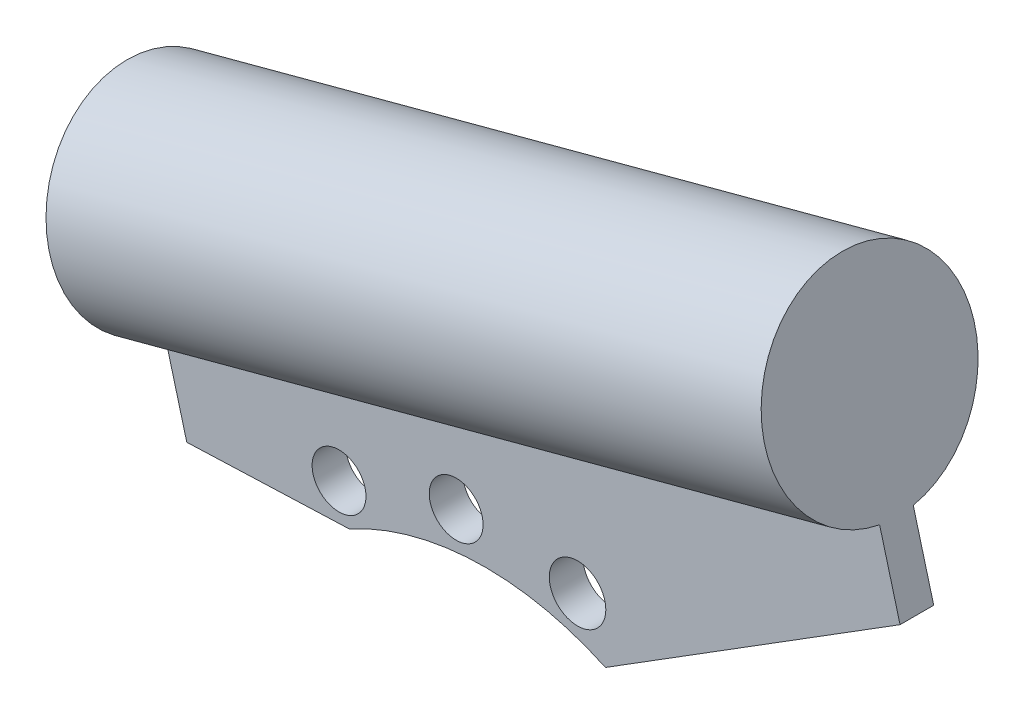
ISO-10303-21;
HEADER;
FILE_DESCRIPTION(('STEP AP214'),'2;1');
FILE_NAME('part.step','',(''),(''),'','','');
FILE_SCHEMA(('AUTOMOTIVE_DESIGN { 1 0 10303 214 1 1 1 1 }'));
ENDSEC;
DATA;
#1=APPLICATION_CONTEXT('core data for automotive mechanical design processes');
#2=APPLICATION_PROTOCOL_DEFINITION('international standard','automotive_design',2000,#1);
#3=PRODUCT_CONTEXT('',#1,'mechanical');
#4=PRODUCT('Part','Part','',(#3));
#5=PRODUCT_RELATED_PRODUCT_CATEGORY('part','',(#4));
#6=PRODUCT_DEFINITION_FORMATION('','',#4);
#7=PRODUCT_DEFINITION_CONTEXT('part definition',#1,'design');
#8=PRODUCT_DEFINITION('design','',#6,#7);
#9=PRODUCT_DEFINITION_SHAPE('','',#8);
#10=(LENGTH_UNIT() NAMED_UNIT(*) SI_UNIT(.MILLI.,.METRE.));
#11=(NAMED_UNIT(*) PLANE_ANGLE_UNIT() SI_UNIT($,.RADIAN.));
#12=(NAMED_UNIT(*) SI_UNIT($,.STERADIAN.) SOLID_ANGLE_UNIT());
#13=UNCERTAINTY_MEASURE_WITH_UNIT(LENGTH_MEASURE(1.E-05),#10,'distance_accuracy_value','');
#14=(GEOMETRIC_REPRESENTATION_CONTEXT(3) GLOBAL_UNCERTAINTY_ASSIGNED_CONTEXT((#13)) GLOBAL_UNIT_ASSIGNED_CONTEXT((#10,
#11,#12)) REPRESENTATION_CONTEXT('',''));
#15=CARTESIAN_POINT('',(0.,0.,0.));
#16=DIRECTION('',(0.,0.,1.));
#17=DIRECTION('',(1.,0.,0.));
#18=AXIS2_PLACEMENT_3D('',#15,#16,#17);
#19=CARTESIAN_POINT('',(-29.4571439349625,-2.39394581853957,37.6705448354942));
#20=DIRECTION('',(0.,0.,1.));
#21=DIRECTION('',(1.,0.,0.));
#22=AXIS2_PLACEMENT_3D('',#19,#20,#21);
#23=PLANE('',#22);
#24=DIRECTION('',(-0.99927538390009,-0.0380618855461445,0.));
#25=VECTOR('',#24,1.);
#26=CARTESIAN_POINT('',(-73.8146430955072,33.5000235951735,37.6705448354942));
#27=LINE('',#26,#25);
#28=CARTESIAN_POINT('',(-49.6752451538477,34.419480850312,37.6705448354942));
#29=VERTEX_POINT('',#28);
#30=CARTESIAN_POINT('',(-73.8146430955072,33.5000235951735,37.6705448354942));
#31=VERTEX_POINT('',#30);
#32=EDGE_CURVE('E145',#29,#31,#27,.T.);
#33=ORIENTED_EDGE('',*,*,#32,.F.);
#34=CARTESIAN_POINT('',(-29.4571439349625,-2.39394581853957,37.6705448354942));
#35=DIRECTION('',(0.,0.,-1.));
#36=DIRECTION('',(1.,0.,0.));
#37=AXIS2_PLACEMENT_3D('',#34,#35,#36);
#38=CIRCLE('',#37,42.);
#39=CARTESIAN_POINT('',(-11.6122935002385,35.6265922229234,37.6705448354942));
#40=VERTEX_POINT('',#39);
#41=EDGE_CURVE('E98',#29,#40,#38,.T.);
#42=ORIENTED_EDGE('',*,*,#41,.T.);
#43=DIRECTION('',(0.847720122219754,0.530443771180062,0.));
#44=VECTOR('',#43,1.);
#45=CARTESIAN_POINT('',(32.1573409988721,63.0145583432588,37.6705448354942));
#46=LINE('',#45,#44);
#47=CARTESIAN_POINT('',(32.1573409988721,63.0145583432588,37.6705448354942));
#48=VERTEX_POINT('',#47);
#49=EDGE_CURVE('E56',#40,#48,#46,.T.);
#50=ORIENTED_EDGE('',*,*,#49,.T.);
#51=DIRECTION('',(-0.258819045102519,0.965925826289069,0.));
#52=VECTOR('',#51,1.);
#53=CARTESIAN_POINT('',(29.1715815578497,74.1575642763329,37.6705448354942));
#54=LINE('',#53,#52);
#55=CARTESIAN_POINT('',(29.119397565894,74.3523175856536,37.6705448354942));
#56=VERTEX_POINT('',#55);
#57=EDGE_CURVE('E87',#48,#56,#54,.T.);
#58=ORIENTED_EDGE('',*,*,#57,.T.);
#59=DIRECTION('',(-0.965925826289069,-0.25881904510252,0.));
#60=VECTOR('',#59,1.);
#61=CARTESIAN_POINT('',(25.2556942607377,73.3170414052435,37.6705448354942));
#62=LINE('',#61,#60);
#63=CARTESIAN_POINT('',(-77.1324433259036,45.8822226243765,37.6705448354942));
#64=VERTEX_POINT('',#63);
#65=EDGE_CURVE('E126',#56,#64,#62,.T.);
#66=ORIENTED_EDGE('',*,*,#65,.T.);
#67=DIRECTION('',(0.25881904510252,-0.965925826289069,0.));
#68=VECTOR('',#67,1.);
#69=CARTESIAN_POINT('',(-70.4968428651108,21.1178245659705,37.6705448354942));
#70=LINE('',#69,#68);
#71=EDGE_CURVE('E95',#64,#31,#70,.T.);
#72=ORIENTED_EDGE('',*,*,#71,.T.);
#73=EDGE_LOOP('',(#33,#42,#50,#58,#66,#72));
#74=FACE_BOUND('',#73,.T.);
#75=CARTESIAN_POINT('',(-33.7913593844898,44.9078995623503,37.6705448354942));
#76=DIRECTION('',(0.,0.,1.));
#77=DIRECTION('',(1.,0.,0.));
#78=AXIS2_PLACEMENT_3D('',#75,#76,#77);
#79=CIRCLE('',#78,4.00000000000001);
#80=CARTESIAN_POINT('',(-29.7913593844898,44.9078995623503,37.6705448354942));
#81=VERTEX_POINT('',#80);
#82=EDGE_CURVE('E112',#81,#81,#79,.T.);
#83=ORIENTED_EDGE('',*,*,#82,.F.);
#84=EDGE_LOOP('',(#83));
#85=FACE_BOUND('',#84,.T.);
#86=CARTESIAN_POINT('',(-51.1953416823968,39.8399358251565,37.6705448354942));
#87=DIRECTION('',(0.,0.,1.));
#88=DIRECTION('',(1.,0.,0.));
#89=AXIS2_PLACEMENT_3D('',#86,#87,#88);
#90=CIRCLE('',#89,3.99999999999999);
#91=CARTESIAN_POINT('',(-47.1953416823968,39.8399358251565,37.6705448354942));
#92=VERTEX_POINT('',#91);
#93=EDGE_CURVE('E105',#92,#92,#90,.T.);
#94=ORIENTED_EDGE('',*,*,#93,.F.);
#95=EDGE_LOOP('',(#94));
#96=FACE_BOUND('',#95,.T.);
#97=CARTESIAN_POINT('',(-15.7561753615586,43.0871871945165,37.6705448354942));
#98=DIRECTION('',(0.,0.,1.));
#99=DIRECTION('',(1.,0.,0.));
#100=AXIS2_PLACEMENT_3D('',#97,#98,#99);
#101=CIRCLE('',#100,4.19887395581143);
#102=CARTESIAN_POINT('',(-11.5573014057472,43.0871871945165,37.6705448354942));
#103=VERTEX_POINT('',#102);
#104=EDGE_CURVE('E118',#103,#103,#101,.T.);
#105=ORIENTED_EDGE('',*,*,#104,.F.);
#106=EDGE_LOOP('',(#105));
#107=FACE_BOUND('',#106,.T.);
#108=ADVANCED_FACE('F33',(#74,#85,#96,#107),#23,.T.);
#109=CARTESIAN_POINT('',(-29.4571439349625,-2.39394581853957,32.6705448354942));
#110=DIRECTION('',(0.,0.,1.));
#111=DIRECTION('',(1.,0.,0.));
#112=AXIS2_PLACEMENT_3D('',#109,#110,#111);
#113=PLANE('',#112);
#114=CARTESIAN_POINT('',(-29.4571439349625,-2.39394581853957,32.6705448354942));
#115=DIRECTION('',(0.,0.,-1.));
#116=DIRECTION('',(1.,0.,0.));
#117=AXIS2_PLACEMENT_3D('',#114,#115,#116);
#118=CIRCLE('',#117,42.);
#119=CARTESIAN_POINT('',(-49.6752451538476,34.419480850312,32.6705448354942));
#120=VERTEX_POINT('',#119);
#121=CARTESIAN_POINT('',(-11.6122935002385,35.6265922229234,32.6705448354942));
#122=VERTEX_POINT('',#121);
#123=EDGE_CURVE('E79',#120,#122,#118,.T.);
#124=ORIENTED_EDGE('',*,*,#123,.F.);
#125=DIRECTION('',(-0.99927538390009,-0.0380618855461445,0.));
#126=VECTOR('',#125,1.);
#127=CARTESIAN_POINT('',(-30.8866071511142,35.1351304107334,32.6705448354942));
#128=LINE('',#127,#126);
#129=CARTESIAN_POINT('',(-73.8146430955072,33.5000235951735,32.6705448354942));
#130=VERTEX_POINT('',#129);
#131=EDGE_CURVE('E48',#120,#130,#128,.T.);
#132=ORIENTED_EDGE('',*,*,#131,.T.);
#133=DIRECTION('',(0.25881904510252,-0.965925826289069,0.));
#134=VECTOR('',#133,1.);
#135=CARTESIAN_POINT('',(-70.4968428651108,21.1178245659705,32.6705448354942));
#136=LINE('',#135,#134);
#137=CARTESIAN_POINT('',(-77.1324433259036,45.8822226243765,32.6705448354942));
#138=VERTEX_POINT('',#137);
#139=EDGE_CURVE('E102',#138,#130,#136,.T.);
#140=ORIENTED_EDGE('',*,*,#139,.F.);
#141=DIRECTION('',(-0.965925826289069,-0.25881904510252,0.));
#142=VECTOR('',#141,1.);
#143=CARTESIAN_POINT('',(25.2556942607377,73.3170414052435,32.6705448354942));
#144=LINE('',#143,#142);
#145=CARTESIAN_POINT('',(29.119397565894,74.3523175856536,32.6705448354942));
#146=VERTEX_POINT('',#145);
#147=EDGE_CURVE('E93',#146,#138,#144,.T.);
#148=ORIENTED_EDGE('',*,*,#147,.F.);
#149=DIRECTION('',(-0.258819045102519,0.965925826289069,0.));
#150=VECTOR('',#149,1.);
#151=CARTESIAN_POINT('',(29.1715815578497,74.1575642763329,32.6705448354942));
#152=LINE('',#151,#150);
#153=CARTESIAN_POINT('',(32.1573409988721,63.0145583432588,32.6705448354942));
#154=VERTEX_POINT('',#153);
#155=EDGE_CURVE('E78',#154,#146,#152,.T.);
#156=ORIENTED_EDGE('',*,*,#155,.F.);
#157=DIRECTION('',(0.847720122219754,0.530443771180062,0.));
#158=VECTOR('',#157,1.);
#159=CARTESIAN_POINT('',(32.1573409988721,63.0145583432588,32.6705448354942));
#160=LINE('',#159,#158);
#161=EDGE_CURVE('E69',#122,#154,#160,.T.);
#162=ORIENTED_EDGE('',*,*,#161,.F.);
#163=EDGE_LOOP('',(#124,#132,#140,#148,#156,#162));
#164=FACE_BOUND('',#163,.T.);
#165=CARTESIAN_POINT('',(-51.1953416823968,39.8399358251565,32.6705448354942));
#166=DIRECTION('',(0.,0.,1.));
#167=DIRECTION('',(1.,0.,0.));
#168=AXIS2_PLACEMENT_3D('',#165,#166,#167);
#169=CIRCLE('',#168,3.99999999999999);
#170=CARTESIAN_POINT('',(-47.1953416823968,39.8399358251565,32.6705448354942));
#171=VERTEX_POINT('',#170);
#172=EDGE_CURVE('E109',#171,#171,#169,.T.);
#173=ORIENTED_EDGE('',*,*,#172,.T.);
#174=EDGE_LOOP('',(#173));
#175=FACE_BOUND('',#174,.T.);
#176=CARTESIAN_POINT('',(-33.7913593844898,44.9078995623503,32.6705448354942));
#177=DIRECTION('',(0.,0.,1.));
#178=DIRECTION('',(1.,0.,0.));
#179=AXIS2_PLACEMENT_3D('',#176,#177,#178);
#180=CIRCLE('',#179,4.00000000000001);
#181=CARTESIAN_POINT('',(-29.7913593844898,44.9078995623503,32.6705448354942));
#182=VERTEX_POINT('',#181);
#183=EDGE_CURVE('E115',#182,#182,#180,.T.);
#184=ORIENTED_EDGE('',*,*,#183,.T.);
#185=EDGE_LOOP('',(#184));
#186=FACE_BOUND('',#185,.T.);
#187=CARTESIAN_POINT('',(-15.7561753615586,43.0871871945165,32.6705448354942));
#188=DIRECTION('',(0.,0.,1.));
#189=DIRECTION('',(1.,0.,0.));
#190=AXIS2_PLACEMENT_3D('',#187,#188,#189);
#191=CIRCLE('',#190,4.19887395581143);
#192=CARTESIAN_POINT('',(-11.5573014057472,43.0871871945165,32.6705448354942));
#193=VERTEX_POINT('',#192);
#194=EDGE_CURVE('E121',#193,#193,#191,.T.);
#195=ORIENTED_EDGE('',*,*,#194,.T.);
#196=EDGE_LOOP('',(#195));
#197=FACE_BOUND('',#196,.T.);
#198=ADVANCED_FACE('F89',(#164,#175,#186,#197),#113,.F.);
#199=CARTESIAN_POINT('',(-70.4968428651108,21.1178245659705,37.6705448354942));
#200=DIRECTION('',(0.965925826289069,0.25881904510252,0.));
#201=DIRECTION('',(-0.25881904510252,0.965925826289069,0.));
#202=AXIS2_PLACEMENT_3D('',#199,#200,#201);
#203=PLANE('',#202);
#204=ORIENTED_EDGE('',*,*,#139,.T.);
#205=DIRECTION('',(0.,0.,1.));
#206=VECTOR('',#205,1.);
#207=CARTESIAN_POINT('',(-73.8146430955072,33.5000235951735,27.6705448354942));
#208=LINE('',#207,#206);
#209=EDGE_CURVE('E142',#130,#31,#208,.T.);
#210=ORIENTED_EDGE('',*,*,#209,.T.);
#211=ORIENTED_EDGE('',*,*,#71,.F.);
#212=CARTESIAN_POINT('',(-81.1178364375471,60.7559122051652,35.1705448354942));
#213=DIRECTION('',(-0.965925826289069,-0.25881904510252,0.));
#214=DIRECTION('',(0.25881904510252,-0.965925826289069,0.));
#215=AXIS2_PLACEMENT_3D('',#212,#213,#214);
#216=CIRCLE('',#215,15.6);
#217=EDGE_CURVE('E129',#64,#138,#216,.T.);
#218=ORIENTED_EDGE('',*,*,#217,.T.);
#219=EDGE_LOOP('',(#204,#210,#211,#218));
#220=FACE_BOUND('',#219,.T.);
#221=CARTESIAN_POINT('',(-81.1178364375471,60.7559122051652,35.1705448354942));
#222=DIRECTION('',(-0.965925826289069,-0.25881904510252,0.));
#223=DIRECTION('',(0.25881904510252,-0.965925826289069,0.));
#224=AXIS2_PLACEMENT_3D('',#221,#222,#223);
#225=CIRCLE('',#224,13.5);
#226=CARTESIAN_POINT('',(-77.6237793286631,47.7159135502628,35.1705448354942));
#227=VERTEX_POINT('',#226);
#228=EDGE_CURVE('E134',#227,#227,#225,.T.);
#229=ORIENTED_EDGE('',*,*,#228,.F.);
#230=EDGE_LOOP('',(#229));
#231=FACE_BOUND('',#230,.T.);
#232=ADVANCED_FACE('F35',(#220,#231),#203,.F.);
#233=CARTESIAN_POINT('',(-29.4571439349625,-2.39394581853957,37.6705448354942));
#234=DIRECTION('',(0.,0.,-1.));
#235=DIRECTION('',(-1.,0.,0.));
#236=AXIS2_PLACEMENT_3D('',#233,#234,#235);
#237=CYLINDRICAL_SURFACE('',#236,42.);
#238=ORIENTED_EDGE('',*,*,#41,.F.);
#239=DIRECTION('',(0.,0.,-1.));
#240=VECTOR('',#239,1.);
#241=CARTESIAN_POINT('',(-49.6752451538476,34.419480850312,37.6705448354942));
#242=LINE('',#241,#240);
#243=EDGE_CURVE('E11',#29,#120,#242,.T.);
#244=ORIENTED_EDGE('',*,*,#243,.T.);
#245=ORIENTED_EDGE('',*,*,#123,.T.);
#246=DIRECTION('',(0.,0.,-1.));
#247=VECTOR('',#246,1.);
#248=CARTESIAN_POINT('',(-11.6122935002385,35.6265922229234,37.6705448354942));
#249=LINE('',#248,#247);
#250=EDGE_CURVE('E41',#40,#122,#249,.T.);
#251=ORIENTED_EDGE('',*,*,#250,.F.);
#252=EDGE_LOOP('',(#238,#244,#245,#251));
#253=FACE_BOUND('',#252,.T.);
#254=ADVANCED_FACE('F170',(#253),#237,.F.);
#255=CARTESIAN_POINT('',(32.1573409988721,63.0145583432588,37.6705448354942));
#256=DIRECTION('',(-0.530443771180062,0.847720122219754,0.));
#257=DIRECTION('',(-0.847720122219754,-0.530443771180062,0.));
#258=AXIS2_PLACEMENT_3D('',#255,#256,#257);
#259=PLANE('',#258);
#260=ORIENTED_EDGE('',*,*,#161,.T.);
#261=DIRECTION('',(0.,0.,-1.));
#262=VECTOR('',#261,1.);
#263=CARTESIAN_POINT('',(32.1573409988721,63.0145583432588,37.6705448354942));
#264=LINE('',#263,#262);
#265=EDGE_CURVE('E72',#48,#154,#264,.T.);
#266=ORIENTED_EDGE('',*,*,#265,.F.);
#267=ORIENTED_EDGE('',*,*,#49,.F.);
#268=ORIENTED_EDGE('',*,*,#250,.T.);
#269=EDGE_LOOP('',(#260,#266,#267,#268));
#270=FACE_BOUND('',#269,.T.);
#271=ADVANCED_FACE('F71',(#270),#259,.F.);
#272=CARTESIAN_POINT('',(29.1715815578497,74.1575642763329,37.6705448354942));
#273=DIRECTION('',(-0.965925826289069,-0.258819045102519,0.));
#274=DIRECTION('',(0.258819045102519,-0.965925826289069,0.));
#275=AXIS2_PLACEMENT_3D('',#272,#273,#274);
#276=PLANE('',#275);
#277=ORIENTED_EDGE('',*,*,#155,.T.);
#278=CARTESIAN_POINT('',(25.1340044542504,89.2260071664424,35.1705448354942));
#279=DIRECTION('',(0.965925826289069,0.25881904510252,0.));
#280=DIRECTION('',(-0.25881904510252,0.965925826289069,0.));
#281=AXIS2_PLACEMENT_3D('',#278,#279,#280);
#282=CIRCLE('',#281,15.6);
#283=EDGE_CURVE('E137',#146,#56,#282,.T.);
#284=ORIENTED_EDGE('',*,*,#283,.T.);
#285=ORIENTED_EDGE('',*,*,#57,.F.);
#286=ORIENTED_EDGE('',*,*,#265,.T.);
#287=EDGE_LOOP('',(#277,#284,#285,#286));
#288=FACE_BOUND('',#287,.T.);
#289=ADVANCED_FACE('F83',(#288),#276,.F.);
#290=CARTESIAN_POINT('',(-51.1953416823968,39.8399358251565,37.6705448354942));
#291=DIRECTION('',(0.,0.,-1.));
#292=DIRECTION('',(-1.,0.,0.));
#293=AXIS2_PLACEMENT_3D('',#290,#291,#292);
#294=CYLINDRICAL_SURFACE('',#293,3.99999999999999);
#295=ORIENTED_EDGE('',*,*,#93,.T.);
#296=EDGE_LOOP('',(#295));
#297=FACE_BOUND('',#296,.T.);
#298=ORIENTED_EDGE('',*,*,#172,.F.);
#299=EDGE_LOOP('',(#298));
#300=FACE_BOUND('',#299,.T.);
#301=ADVANCED_FACE('F184',(#297,#300),#294,.F.);
#302=CARTESIAN_POINT('',(-33.7913593844898,44.9078995623503,37.6705448354942));
#303=DIRECTION('',(0.,0.,-1.));
#304=DIRECTION('',(-1.,0.,0.));
#305=AXIS2_PLACEMENT_3D('',#302,#303,#304);
#306=CYLINDRICAL_SURFACE('',#305,4.00000000000001);
#307=ORIENTED_EDGE('',*,*,#82,.T.);
#308=EDGE_LOOP('',(#307));
#309=FACE_BOUND('',#308,.T.);
#310=ORIENTED_EDGE('',*,*,#183,.F.);
#311=EDGE_LOOP('',(#310));
#312=FACE_BOUND('',#311,.T.);
#313=ADVANCED_FACE('F191',(#309,#312),#306,.F.);
#314=CARTESIAN_POINT('',(-15.7561753615586,43.0871871945165,37.6705448354942));
#315=DIRECTION('',(0.,0.,-1.));
#316=DIRECTION('',(-1.,0.,0.));
#317=AXIS2_PLACEMENT_3D('',#314,#315,#316);
#318=CYLINDRICAL_SURFACE('',#317,4.19887395581143);
#319=ORIENTED_EDGE('',*,*,#104,.T.);
#320=EDGE_LOOP('',(#319));
#321=FACE_BOUND('',#320,.T.);
#322=ORIENTED_EDGE('',*,*,#194,.F.);
#323=EDGE_LOOP('',(#322));
#324=FACE_BOUND('',#323,.T.);
#325=ADVANCED_FACE('F196',(#321,#324),#318,.F.);
#326=CARTESIAN_POINT('',(21.2703011490941,88.1907309860323,35.1705448354942));
#327=DIRECTION('',(-0.965925826289069,-0.25881904510252,0.));
#328=DIRECTION('',(0.25881904510252,-0.965925826289069,0.));
#329=AXIS2_PLACEMENT_3D('',#326,#327,#328);
#330=CYLINDRICAL_SURFACE('',#329,15.6);
#331=ORIENTED_EDGE('',*,*,#217,.F.);
#332=ORIENTED_EDGE('',*,*,#65,.F.);
#333=ORIENTED_EDGE('',*,*,#283,.F.);
#334=ORIENTED_EDGE('',*,*,#147,.T.);
#335=EDGE_LOOP('',(#331,#332,#333,#334));
#336=FACE_BOUND('',#335,.T.);
#337=ADVANCED_FACE('F164',(#336),#330,.T.);
#338=CARTESIAN_POINT('',(21.2703011490941,88.1907309860323,35.1705448354942));
#339=DIRECTION('',(-0.965925826289069,-0.25881904510252,0.));
#340=DIRECTION('',(0.25881904510252,-0.965925826289069,0.));
#341=AXIS2_PLACEMENT_3D('',#338,#339,#340);
#342=CYLINDRICAL_SURFACE('',#341,13.5);
#343=CARTESIAN_POINT('',(21.2703011490941,88.1907309860323,35.1705448354942));
#344=DIRECTION('',(-0.965925826289069,-0.25881904510252,0.));
#345=DIRECTION('',(0.25881904510252,-0.965925826289069,0.));
#346=AXIS2_PLACEMENT_3D('',#343,#344,#345);
#347=CIRCLE('',#346,13.5);
#348=CARTESIAN_POINT('',(24.7643582579781,75.1507323311299,35.1705448354942));
#349=VERTEX_POINT('',#348);
#350=EDGE_CURVE('E133',#349,#349,#347,.T.);
#351=ORIENTED_EDGE('',*,*,#350,.F.);
#352=EDGE_LOOP('',(#351));
#353=FACE_BOUND('',#352,.T.);
#354=ORIENTED_EDGE('',*,*,#228,.T.);
#355=EDGE_LOOP('',(#354));
#356=FACE_BOUND('',#355,.T.);
#357=ADVANCED_FACE('F212',(#353,#356),#342,.F.);
#358=CARTESIAN_POINT('',(21.2703011490941,88.1907309860323,35.1705448354942));
#359=DIRECTION('',(0.965925826289069,0.25881904510252,0.));
#360=DIRECTION('',(-0.25881904510252,0.965925826289069,0.));
#361=AXIS2_PLACEMENT_3D('',#358,#359,#360);
#362=PLANE('',#361);
#363=ORIENTED_EDGE('',*,*,#350,.T.);
#364=EDGE_LOOP('',(#363));
#365=FACE_BOUND('',#364,.T.);
#366=ADVANCED_FACE('F217',(#365),#362,.F.);
#367=CARTESIAN_POINT('',(-73.8146430955072,33.5000235951735,27.6705448354942));
#368=DIRECTION('',(-0.0380618855461445,0.99927538390009,0.));
#369=DIRECTION('',(-0.99927538390009,-0.0380618855461445,0.));
#370=AXIS2_PLACEMENT_3D('',#367,#368,#369);
#371=PLANE('',#370);
#372=ORIENTED_EDGE('',*,*,#243,.F.);
#373=ORIENTED_EDGE('',*,*,#32,.T.);
#374=ORIENTED_EDGE('',*,*,#209,.F.);
#375=ORIENTED_EDGE('',*,*,#131,.F.);
#376=EDGE_LOOP('',(#372,#373,#374,#375));
#377=FACE_BOUND('',#376,.T.);
#378=ADVANCED_FACE('F149',(#377),#371,.F.);
#379=CLOSED_SHELL('',(#108,#198,#232,#254,#271,#289,#301,#313,#325,#337,#357,#366,#378));
#380=MANIFOLD_SOLID_BREP('B2',#379);
#381=ADVANCED_BREP_SHAPE_REPRESENTATION('',(#18,#380),#14);
#382=SHAPE_DEFINITION_REPRESENTATION(#9,#381);
ENDSEC;
END-ISO-10303-21;
